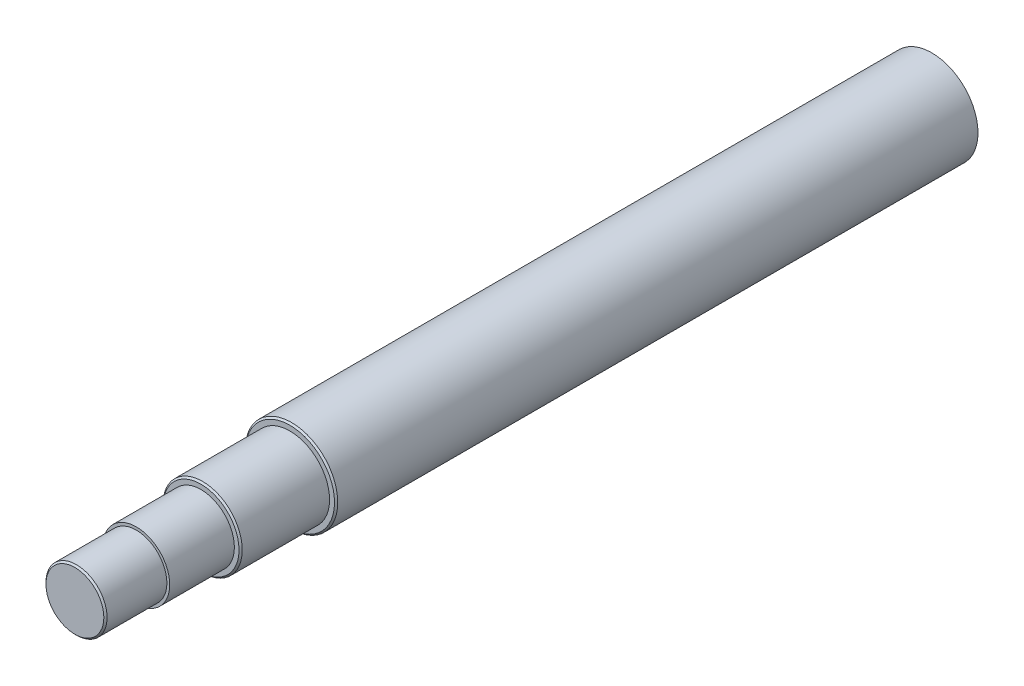
ISO-10303-21;
HEADER;
FILE_DESCRIPTION(('STEP AP214'),'2;1');
FILE_NAME('part.step','',(''),(''),'','','');
FILE_SCHEMA(('AUTOMOTIVE_DESIGN { 1 0 10303 214 1 1 1 1 }'));
ENDSEC;
DATA;
#1=APPLICATION_CONTEXT('core data for automotive mechanical design processes');
#2=APPLICATION_PROTOCOL_DEFINITION('international standard','automotive_design',2000,#1);
#3=PRODUCT_CONTEXT('',#1,'mechanical');
#4=PRODUCT('Part','Part','',(#3));
#5=PRODUCT_RELATED_PRODUCT_CATEGORY('part','',(#4));
#6=PRODUCT_DEFINITION_FORMATION('','',#4);
#7=PRODUCT_DEFINITION_CONTEXT('part definition',#1,'design');
#8=PRODUCT_DEFINITION('design','',#6,#7);
#9=PRODUCT_DEFINITION_SHAPE('','',#8);
#10=(LENGTH_UNIT() NAMED_UNIT(*) SI_UNIT(.MILLI.,.METRE.));
#11=(NAMED_UNIT(*) PLANE_ANGLE_UNIT() SI_UNIT($,.RADIAN.));
#12=(NAMED_UNIT(*) SI_UNIT($,.STERADIAN.) SOLID_ANGLE_UNIT());
#13=UNCERTAINTY_MEASURE_WITH_UNIT(LENGTH_MEASURE(1.E-05),#10,'distance_accuracy_value','');
#14=(GEOMETRIC_REPRESENTATION_CONTEXT(3) GLOBAL_UNCERTAINTY_ASSIGNED_CONTEXT((#13)) GLOBAL_UNIT_ASSIGNED_CONTEXT((#10,
#11,#12)) REPRESENTATION_CONTEXT('',''));
#15=CARTESIAN_POINT('',(0.,0.,0.));
#16=DIRECTION('',(0.,0.,1.));
#17=DIRECTION('',(1.,0.,0.));
#18=AXIS2_PLACEMENT_3D('',#15,#16,#17);
#19=CARTESIAN_POINT('',(0.,0.,452.));
#20=DIRECTION('',(0.,0.,1.));
#21=DIRECTION('',(1.,0.,0.));
#22=AXIS2_PLACEMENT_3D('',#19,#20,#21);
#23=PLANE('',#22);
#24=CARTESIAN_POINT('',(0.,0.,452.));
#25=DIRECTION('',(0.,0.,1.));
#26=DIRECTION('',(1.,0.,0.));
#27=AXIS2_PLACEMENT_3D('',#24,#25,#26);
#28=CIRCLE('',#27,23.5);
#29=CARTESIAN_POINT('',(23.5,0.,452.));
#30=VERTEX_POINT('',#29);
#31=EDGE_CURVE('E80',#30,#30,#28,.T.);
#32=ORIENTED_EDGE('',*,*,#31,.T.);
#33=EDGE_LOOP('',(#32));
#34=FACE_BOUND('',#33,.T.);
#35=CARTESIAN_POINT('',(0.,0.,452.));
#36=DIRECTION('',(0.,0.,1.));
#37=DIRECTION('',(1.,0.,0.));
#38=AXIS2_PLACEMENT_3D('',#35,#36,#37);
#39=CIRCLE('',#38,20.64);
#40=CARTESIAN_POINT('',(20.64,0.,452.));
#41=VERTEX_POINT('',#40);
#42=EDGE_CURVE('E103',#41,#41,#39,.T.);
#43=ORIENTED_EDGE('',*,*,#42,.F.);
#44=EDGE_LOOP('',(#43));
#45=FACE_BOUND('',#44,.T.);
#46=ADVANCED_FACE('F61',(#34,#45),#23,.T.);
#47=CARTESIAN_POINT('',(0.,0.,492.));
#48=DIRECTION('',(0.,0.,1.));
#49=DIRECTION('',(1.,0.,0.));
#50=AXIS2_PLACEMENT_3D('',#47,#48,#49);
#51=PLANE('',#50);
#52=CARTESIAN_POINT('',(0.,0.,492.));
#53=DIRECTION('',(0.,0.,1.));
#54=DIRECTION('',(1.,0.,0.));
#55=AXIS2_PLACEMENT_3D('',#52,#53,#54);
#56=CIRCLE('',#55,18.9);
#57=CARTESIAN_POINT('',(18.9,0.,492.));
#58=VERTEX_POINT('',#57);
#59=EDGE_CURVE('E99',#58,#58,#56,.T.);
#60=ORIENTED_EDGE('',*,*,#59,.F.);
#61=EDGE_LOOP('',(#60));
#62=FACE_BOUND('',#61,.T.);
#63=CARTESIAN_POINT('',(0.,0.,492.));
#64=DIRECTION('',(0.,0.,1.));
#65=DIRECTION('',(1.,0.,0.));
#66=AXIS2_PLACEMENT_3D('',#63,#64,#65);
#67=CIRCLE('',#66,20.64);
#68=CARTESIAN_POINT('',(20.64,0.,492.));
#69=VERTEX_POINT('',#68);
#70=EDGE_CURVE('E104',#69,#69,#67,.T.);
#71=ORIENTED_EDGE('',*,*,#70,.T.);
#72=EDGE_LOOP('',(#71));
#73=FACE_BOUND('',#72,.T.);
#74=ADVANCED_FACE('F146',(#62,#73),#51,.T.);
#75=CARTESIAN_POINT('',(0.,0.,492.));
#76=DIRECTION('',(0.,0.,1.));
#77=DIRECTION('',(1.,0.,0.));
#78=AXIS2_PLACEMENT_3D('',#75,#76,#77);
#79=CYLINDRICAL_SURFACE('',#78,18.9);
#80=CARTESIAN_POINT('',(0.,0.,529.));
#81=DIRECTION('',(0.,0.,1.));
#82=DIRECTION('',(1.,0.,0.));
#83=AXIS2_PLACEMENT_3D('',#80,#81,#82);
#84=CIRCLE('',#83,18.9);
#85=CARTESIAN_POINT('',(18.9,0.,529.));
#86=VERTEX_POINT('',#85);
#87=EDGE_CURVE('E12',#86,#86,#84,.F.);
#88=ORIENTED_EDGE('',*,*,#87,.T.);
#89=EDGE_LOOP('',(#88));
#90=FACE_BOUND('',#89,.T.);
#91=ORIENTED_EDGE('',*,*,#59,.T.);
#92=EDGE_LOOP('',(#91));
#93=FACE_BOUND('',#92,.T.);
#94=ADVANCED_FACE('F152',(#90,#93),#79,.T.);
#95=CARTESIAN_POINT('',(0.,0.,530.));
#96=DIRECTION('',(0.,0.,1.));
#97=DIRECTION('',(1.,0.,0.));
#98=AXIS2_PLACEMENT_3D('',#95,#96,#97);
#99=PLANE('',#98);
#100=CARTESIAN_POINT('',(0.,0.,530.));
#101=DIRECTION('',(0.,0.,1.));
#102=DIRECTION('',(1.,0.,0.));
#103=AXIS2_PLACEMENT_3D('',#100,#101,#102);
#104=CIRCLE('',#103,17.8999999999999);
#105=CARTESIAN_POINT('',(17.8999999999999,0.,530.));
#106=VERTEX_POINT('',#105);
#107=EDGE_CURVE('E70',#106,#106,#104,.T.);
#108=ORIENTED_EDGE('',*,*,#107,.T.);
#109=EDGE_LOOP('',(#108));
#110=FACE_BOUND('',#109,.T.);
#111=ADVANCED_FACE('F161',(#110),#99,.T.);
#112=CARTESIAN_POINT('',(0.,0.,452.));
#113=DIRECTION('',(0.,0.,1.));
#114=DIRECTION('',(1.,0.,0.));
#115=AXIS2_PLACEMENT_3D('',#112,#113,#114);
#116=CYLINDRICAL_SURFACE('',#115,20.64);
#117=ORIENTED_EDGE('',*,*,#42,.T.);
#118=EDGE_LOOP('',(#117));
#119=FACE_BOUND('',#118,.T.);
#120=ORIENTED_EDGE('',*,*,#70,.F.);
#121=EDGE_LOOP('',(#120));
#122=FACE_BOUND('',#121,.T.);
#123=ADVANCED_FACE('F158',(#119,#122),#116,.T.);
#124=CARTESIAN_POINT('',(0.,0.,397.));
#125=DIRECTION('',(0.,0.,1.));
#126=DIRECTION('',(1.,0.,0.));
#127=AXIS2_PLACEMENT_3D('',#124,#125,#126);
#128=PLANE('',#127);
#129=CARTESIAN_POINT('',(0.,0.,397.));
#130=DIRECTION('',(0.,0.,1.));
#131=DIRECTION('',(1.,0.,0.));
#132=AXIS2_PLACEMENT_3D('',#129,#130,#131);
#133=CIRCLE('',#132,27.5750000000001);
#134=CARTESIAN_POINT('',(27.5750000000001,0.,397.));
#135=VERTEX_POINT('',#134);
#136=EDGE_CURVE('E90',#135,#135,#133,.T.);
#137=ORIENTED_EDGE('',*,*,#136,.T.);
#138=EDGE_LOOP('',(#137));
#139=FACE_BOUND('',#138,.T.);
#140=CARTESIAN_POINT('',(0.,0.,397.));
#141=DIRECTION('',(0.,0.,1.));
#142=DIRECTION('',(1.,0.,0.));
#143=AXIS2_PLACEMENT_3D('',#140,#141,#142);
#144=CIRCLE('',#143,24.5);
#145=CARTESIAN_POINT('',(24.5,0.,397.));
#146=VERTEX_POINT('',#145);
#147=EDGE_CURVE('E108',#146,#146,#144,.T.);
#148=ORIENTED_EDGE('',*,*,#147,.F.);
#149=EDGE_LOOP('',(#148));
#150=FACE_BOUND('',#149,.T.);
#151=ADVANCED_FACE('F167',(#139,#150),#128,.T.);
#152=CARTESIAN_POINT('',(0.,0.,397.));
#153=DIRECTION('',(0.,0.,1.));
#154=DIRECTION('',(1.,0.,0.));
#155=AXIS2_PLACEMENT_3D('',#152,#153,#154);
#156=CYLINDRICAL_SURFACE('',#155,24.5);
#157=CARTESIAN_POINT('',(0.,0.,451.));
#158=DIRECTION('',(0.,0.,1.));
#159=DIRECTION('',(1.,0.,0.));
#160=AXIS2_PLACEMENT_3D('',#157,#158,#159);
#161=CIRCLE('',#160,24.5);
#162=CARTESIAN_POINT('',(24.5,0.,451.));
#163=VERTEX_POINT('',#162);
#164=EDGE_CURVE('E75',#163,#163,#161,.F.);
#165=ORIENTED_EDGE('',*,*,#164,.T.);
#166=EDGE_LOOP('',(#165));
#167=FACE_BOUND('',#166,.T.);
#168=ORIENTED_EDGE('',*,*,#147,.T.);
#169=EDGE_LOOP('',(#168));
#170=FACE_BOUND('',#169,.T.);
#171=ADVANCED_FACE('F135',(#167,#170),#156,.T.);
#172=CARTESIAN_POINT('',(0.,0.,0.));
#173=DIRECTION('',(0.,0.,1.));
#174=DIRECTION('',(1.,0.,0.));
#175=AXIS2_PLACEMENT_3D('',#172,#173,#174);
#176=PLANE('',#175);
#177=CARTESIAN_POINT('',(0.,0.,0.));
#178=DIRECTION('',(0.,0.,-1.));
#179=DIRECTION('',(-1.,0.,0.));
#180=AXIS2_PLACEMENT_3D('',#177,#178,#179);
#181=CIRCLE('',#180,5.);
#182=CARTESIAN_POINT('',(-5.,0.,0.));
#183=VERTEX_POINT('',#182);
#184=EDGE_CURVE('E94',#183,#183,#181,.T.);
#185=ORIENTED_EDGE('',*,*,#184,.F.);
#186=EDGE_LOOP('',(#185));
#187=FACE_BOUND('',#186,.T.);
#188=CARTESIAN_POINT('',(0.,0.,0.));
#189=DIRECTION('',(0.,0.,1.));
#190=DIRECTION('',(1.,0.,0.));
#191=AXIS2_PLACEMENT_3D('',#188,#189,#190);
#192=CIRCLE('',#191,28.575);
#193=CARTESIAN_POINT('',(28.575,0.,0.));
#194=VERTEX_POINT('',#193);
#195=EDGE_CURVE('E95',#194,#194,#192,.T.);
#196=ORIENTED_EDGE('',*,*,#195,.F.);
#197=EDGE_LOOP('',(#196));
#198=FACE_BOUND('',#197,.T.);
#199=ADVANCED_FACE('F132',(#187,#198),#176,.F.);
#200=CARTESIAN_POINT('',(0.,0.,530.));
#201=DIRECTION('',(0.,0.,-1.));
#202=DIRECTION('',(-1.,0.,0.));
#203=AXIS2_PLACEMENT_3D('',#200,#201,#202);
#204=CYLINDRICAL_SURFACE('',#203,28.575);
#205=CARTESIAN_POINT('',(0.,0.,396.));
#206=DIRECTION('',(0.,0.,1.));
#207=DIRECTION('',(1.,0.,0.));
#208=AXIS2_PLACEMENT_3D('',#205,#206,#207);
#209=CIRCLE('',#208,28.575);
#210=CARTESIAN_POINT('',(28.575,0.,396.));
#211=VERTEX_POINT('',#210);
#212=EDGE_CURVE('E86',#211,#211,#209,.F.);
#213=ORIENTED_EDGE('',*,*,#212,.T.);
#214=EDGE_LOOP('',(#213));
#215=FACE_BOUND('',#214,.T.);
#216=ORIENTED_EDGE('',*,*,#195,.T.);
#217=EDGE_LOOP('',(#216));
#218=FACE_BOUND('',#217,.T.);
#219=ADVANCED_FACE('F128',(#215,#218),#204,.T.);
#220=CARTESIAN_POINT('',(0.,0.,-5.));
#221=DIRECTION('',(0.,0.,1.));
#222=DIRECTION('',(1.,0.,0.));
#223=AXIS2_PLACEMENT_3D('',#220,#221,#222);
#224=CYLINDRICAL_SURFACE('',#223,5.);
#225=CARTESIAN_POINT('',(0.,0.,-5.));
#226=DIRECTION('',(0.,0.,-1.));
#227=DIRECTION('',(-1.,0.,0.));
#228=AXIS2_PLACEMENT_3D('',#225,#226,#227);
#229=CIRCLE('',#228,5.);
#230=CARTESIAN_POINT('',(-5.,0.,-5.));
#231=VERTEX_POINT('',#230);
#232=EDGE_CURVE('E115',#231,#231,#229,.T.);
#233=ORIENTED_EDGE('',*,*,#232,.F.);
#234=EDGE_LOOP('',(#233));
#235=FACE_BOUND('',#234,.T.);
#236=ORIENTED_EDGE('',*,*,#184,.T.);
#237=EDGE_LOOP('',(#236));
#238=FACE_BOUND('',#237,.T.);
#239=ADVANCED_FACE('F125',(#235,#238),#224,.T.);
#240=CARTESIAN_POINT('',(0.,0.,-5.));
#241=DIRECTION('',(0.,0.,-1.));
#242=DIRECTION('',(-1.,0.,0.));
#243=AXIS2_PLACEMENT_3D('',#240,#241,#242);
#244=PLANE('',#243);
#245=ORIENTED_EDGE('',*,*,#232,.T.);
#246=EDGE_LOOP('',(#245));
#247=FACE_BOUND('',#246,.T.);
#248=ADVANCED_FACE('F123',(#247),#244,.T.);
#249=CARTESIAN_POINT('',(0.,0.,397.));
#250=DIRECTION('',(0.,0.,-1.));
#251=DIRECTION('',(-1.,0.,0.));
#252=AXIS2_PLACEMENT_3D('',#249,#250,#251);
#253=CONICAL_SURFACE('',#252,27.5750000000001,0.785398163397414);
#254=ORIENTED_EDGE('',*,*,#212,.F.);
#255=EDGE_LOOP('',(#254));
#256=FACE_BOUND('',#255,.T.);
#257=ORIENTED_EDGE('',*,*,#136,.F.);
#258=EDGE_LOOP('',(#257));
#259=FACE_BOUND('',#258,.T.);
#260=ADVANCED_FACE('F185',(#256,#259),#253,.T.);
#261=CARTESIAN_POINT('',(0.,0.,452.));
#262=DIRECTION('',(0.,0.,-1.));
#263=DIRECTION('',(-1.,0.,0.));
#264=AXIS2_PLACEMENT_3D('',#261,#262,#263);
#265=CONICAL_SURFACE('',#264,23.5,0.785398163397438);
#266=ORIENTED_EDGE('',*,*,#164,.F.);
#267=EDGE_LOOP('',(#266));
#268=FACE_BOUND('',#267,.T.);
#269=ORIENTED_EDGE('',*,*,#31,.F.);
#270=EDGE_LOOP('',(#269));
#271=FACE_BOUND('',#270,.T.);
#272=ADVANCED_FACE('F189',(#268,#271),#265,.T.);
#273=CARTESIAN_POINT('',(0.,0.,530.));
#274=DIRECTION('',(0.,0.,-1.));
#275=DIRECTION('',(-1.,0.,0.));
#276=AXIS2_PLACEMENT_3D('',#273,#274,#275);
#277=CONICAL_SURFACE('',#276,17.8999999999999,0.78539816339749);
#278=ORIENTED_EDGE('',*,*,#87,.F.);
#279=EDGE_LOOP('',(#278));
#280=FACE_BOUND('',#279,.T.);
#281=ORIENTED_EDGE('',*,*,#107,.F.);
#282=EDGE_LOOP('',(#281));
#283=FACE_BOUND('',#282,.T.);
#284=ADVANCED_FACE('F64',(#280,#283),#277,.T.);
#285=CLOSED_SHELL('',(#46,#74,#94,#111,#123,#151,#171,#199,#219,#239,#248,#260,#272,#284));
#286=MANIFOLD_SOLID_BREP('B2',#285);
#287=ADVANCED_BREP_SHAPE_REPRESENTATION('',(#18,#286),#14);
#288=SHAPE_DEFINITION_REPRESENTATION(#9,#287);
ENDSEC;
END-ISO-10303-21;
